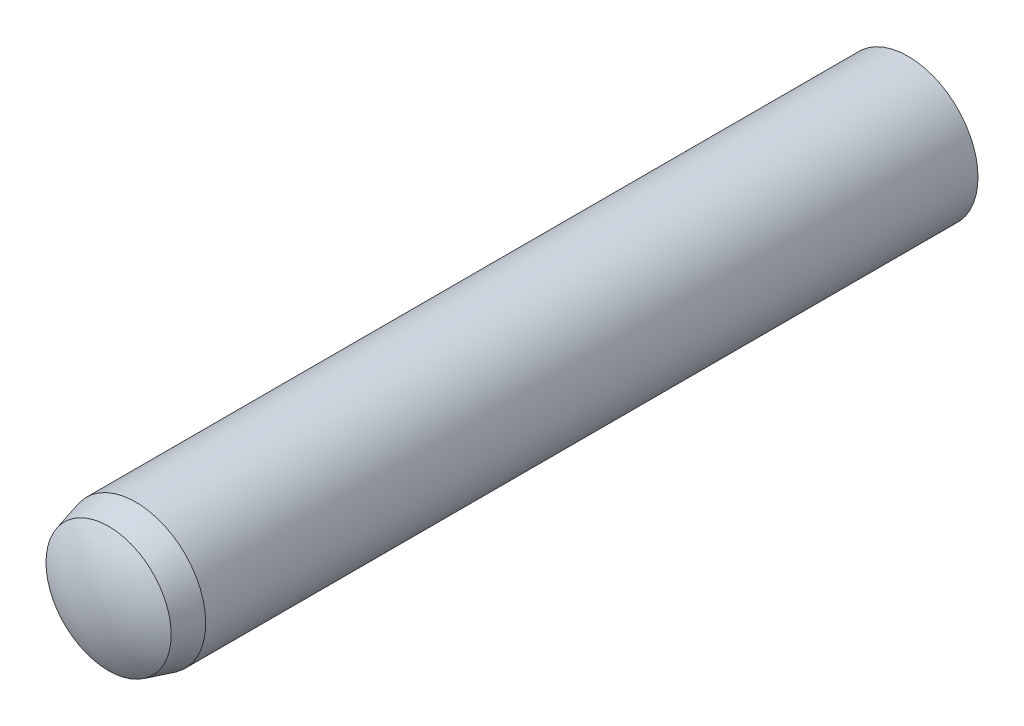
ISO-10303-21;
HEADER;
FILE_DESCRIPTION(('STEP AP214'),'2;1');
FILE_NAME('part.step','',(''),(''),'','','');
FILE_SCHEMA(('AUTOMOTIVE_DESIGN { 1 0 10303 214 1 1 1 1 }'));
ENDSEC;
DATA;
#1=APPLICATION_CONTEXT('core data for automotive mechanical design processes');
#2=APPLICATION_PROTOCOL_DEFINITION('international standard','automotive_design',2000,#1);
#3=PRODUCT_CONTEXT('',#1,'mechanical');
#4=PRODUCT('Part','Part','',(#3));
#5=PRODUCT_RELATED_PRODUCT_CATEGORY('part','',(#4));
#6=PRODUCT_DEFINITION_FORMATION('','',#4);
#7=PRODUCT_DEFINITION_CONTEXT('part definition',#1,'design');
#8=PRODUCT_DEFINITION('design','',#6,#7);
#9=PRODUCT_DEFINITION_SHAPE('','',#8);
#10=(LENGTH_UNIT() NAMED_UNIT(*) SI_UNIT(.MILLI.,.METRE.));
#11=(NAMED_UNIT(*) PLANE_ANGLE_UNIT() SI_UNIT($,.RADIAN.));
#12=(NAMED_UNIT(*) SI_UNIT($,.STERADIAN.) SOLID_ANGLE_UNIT());
#13=UNCERTAINTY_MEASURE_WITH_UNIT(LENGTH_MEASURE(1.E-05),#10,'distance_accuracy_value','');
#14=(GEOMETRIC_REPRESENTATION_CONTEXT(3) GLOBAL_UNCERTAINTY_ASSIGNED_CONTEXT((#13)) GLOBAL_UNIT_ASSIGNED_CONTEXT((#10,
#11,#12)) REPRESENTATION_CONTEXT('',''));
#15=CARTESIAN_POINT('',(0.,0.,0.));
#16=DIRECTION('',(0.,0.,1.));
#17=DIRECTION('',(1.,0.,0.));
#18=AXIS2_PLACEMENT_3D('',#15,#16,#17);
#19=CARTESIAN_POINT('',(0.,0.,-6.27499999999998));
#20=DIRECTION('',(0.,0.,1.));
#21=DIRECTION('',(0.,1.,0.));
#22=AXIS2_PLACEMENT_3D('',#19,#20,#21);
#23=SPHERICAL_SURFACE('',#22,2.72500000000002);
#24=CARTESIAN_POINT('',(0.,0.,-8.55));
#25=DIRECTION('',(0.,0.,1.));
#26=DIRECTION('',(0.,-1.,0.));
#27=AXIS2_PLACEMENT_3D('',#24,#25,#26);
#28=CIRCLE('',#27,1.5);
#29=CARTESIAN_POINT('',(0.,-1.49999999999999,-8.55));
#30=VERTEX_POINT('',#29);
#31=EDGE_CURVE('E10',#30,#30,#28,.T.);
#32=ORIENTED_EDGE('',*,*,#31,.F.);
#33=EDGE_LOOP('',(#32));
#34=FACE_BOUND('',#33,.T.);
#35=ADVANCED_FACE('F33',(#34),#23,.T.);
#36=CARTESIAN_POINT('',(0.,0.,9.));
#37=DIRECTION('',(0.,0.,1.));
#38=DIRECTION('',(0.,-1.,0.));
#39=AXIS2_PLACEMENT_3D('',#36,#37,#38);
#40=CYLINDRICAL_SURFACE('',#39,1.5);
#41=CARTESIAN_POINT('',(0.,0.,8.025));
#42=DIRECTION('',(0.,0.,1.));
#43=DIRECTION('',(0.,-1.,0.));
#44=AXIS2_PLACEMENT_3D('',#41,#42,#43);
#45=CIRCLE('',#44,1.5);
#46=CARTESIAN_POINT('',(0.,-1.5,8.025));
#47=VERTEX_POINT('',#46);
#48=EDGE_CURVE('E39',#47,#47,#45,.T.);
#49=ORIENTED_EDGE('',*,*,#48,.F.);
#50=EDGE_LOOP('',(#49));
#51=FACE_BOUND('',#50,.T.);
#52=ORIENTED_EDGE('',*,*,#31,.T.);
#53=EDGE_LOOP('',(#52));
#54=FACE_BOUND('',#53,.T.);
#55=ADVANCED_FACE('F54',(#51,#54),#40,.T.);
#56=CARTESIAN_POINT('',(0.,0.,8.025));
#57=DIRECTION('',(0.,0.,-1.));
#58=DIRECTION('',(0.,1.,0.));
#59=AXIS2_PLACEMENT_3D('',#56,#57,#58);
#60=CONICAL_SURFACE('',#59,1.5,0.261799387799152);
#61=CARTESIAN_POINT('',(0.,0.,8.61));
#62=DIRECTION('',(0.,0.,1.));
#63=DIRECTION('',(0.,-1.,0.));
#64=AXIS2_PLACEMENT_3D('',#61,#62,#63);
#65=CIRCLE('',#64,1.34324972242779);
#66=CARTESIAN_POINT('',(0.,-1.34324972242779,8.61));
#67=VERTEX_POINT('',#66);
#68=EDGE_CURVE('E43',#67,#67,#65,.T.);
#69=ORIENTED_EDGE('',*,*,#68,.F.);
#70=EDGE_LOOP('',(#69));
#71=FACE_BOUND('',#70,.T.);
#72=ORIENTED_EDGE('',*,*,#48,.T.);
#73=EDGE_LOOP('',(#72));
#74=FACE_BOUND('',#73,.T.);
#75=ADVANCED_FACE('F52',(#71,#74),#60,.T.);
#76=CARTESIAN_POINT('',(0.,0.,6.49176946563802));
#77=DIRECTION('',(0.,0.,1.));
#78=DIRECTION('',(0.,1.,0.));
#79=AXIS2_PLACEMENT_3D('',#76,#77,#78);
#80=SPHERICAL_SURFACE('',#79,2.50823053436198);
#81=ORIENTED_EDGE('',*,*,#68,.T.);
#82=EDGE_LOOP('',(#81));
#83=FACE_BOUND('',#82,.T.);
#84=ADVANCED_FACE('F50',(#83),#80,.T.);
#85=CLOSED_SHELL('',(#35,#55,#75,#84));
#86=MANIFOLD_SOLID_BREP('B2',#85);
#87=ADVANCED_BREP_SHAPE_REPRESENTATION('',(#18,#86),#14);
#88=SHAPE_DEFINITION_REPRESENTATION(#9,#87);
ENDSEC;
END-ISO-10303-21;
